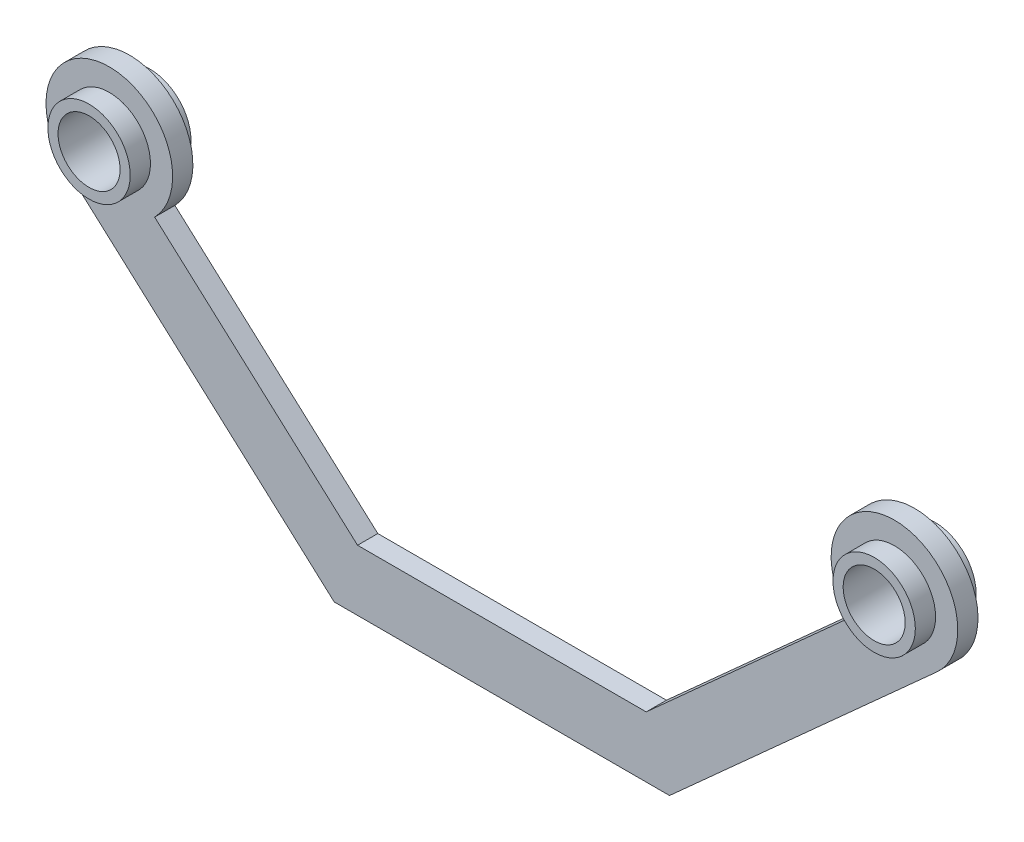
ISO-10303-21;
HEADER;
FILE_DESCRIPTION(('STEP AP214'),'2;1');
FILE_NAME('part.step','',(''),(''),'','','');
FILE_SCHEMA(('AUTOMOTIVE_DESIGN { 1 0 10303 214 1 1 1 1 }'));
ENDSEC;
DATA;
#1=APPLICATION_CONTEXT('core data for automotive mechanical design processes');
#2=APPLICATION_PROTOCOL_DEFINITION('international standard','automotive_design',2000,#1);
#3=PRODUCT_CONTEXT('',#1,'mechanical');
#4=PRODUCT('Part','Part','',(#3));
#5=PRODUCT_RELATED_PRODUCT_CATEGORY('part','',(#4));
#6=PRODUCT_DEFINITION_FORMATION('','',#4);
#7=PRODUCT_DEFINITION_CONTEXT('part definition',#1,'design');
#8=PRODUCT_DEFINITION('design','',#6,#7);
#9=PRODUCT_DEFINITION_SHAPE('','',#8);
#10=(LENGTH_UNIT() NAMED_UNIT(*) SI_UNIT(.MILLI.,.METRE.));
#11=(NAMED_UNIT(*) PLANE_ANGLE_UNIT() SI_UNIT($,.RADIAN.));
#12=(NAMED_UNIT(*) SI_UNIT($,.STERADIAN.) SOLID_ANGLE_UNIT());
#13=UNCERTAINTY_MEASURE_WITH_UNIT(LENGTH_MEASURE(1.E-05),#10,'distance_accuracy_value','');
#14=(GEOMETRIC_REPRESENTATION_CONTEXT(3) GLOBAL_UNCERTAINTY_ASSIGNED_CONTEXT((#13)) GLOBAL_UNIT_ASSIGNED_CONTEXT((#10,
#11,#12)) REPRESENTATION_CONTEXT('',''));
#15=CARTESIAN_POINT('',(0.,0.,0.));
#16=DIRECTION('',(0.,0.,1.));
#17=DIRECTION('',(1.,0.,0.));
#18=AXIS2_PLACEMENT_3D('',#15,#16,#17);
#19=CARTESIAN_POINT('',(0.,0.,4.));
#20=DIRECTION('',(0.,0.,1.));
#21=DIRECTION('',(1.,0.,0.));
#22=AXIS2_PLACEMENT_3D('',#19,#20,#21);
#23=PLANE('',#22);
#24=CARTESIAN_POINT('',(77.5,0.,4.));
#25=DIRECTION('',(0.,0.,1.));
#26=DIRECTION('',(1.,0.,0.));
#27=AXIS2_PLACEMENT_3D('',#24,#25,#26);
#28=CIRCLE('',#27,12.5);
#29=CARTESIAN_POINT('',(68.5526894079265,-8.72901100749507,4.));
#30=VERTEX_POINT('',#29);
#31=CARTESIAN_POINT('',(85.8641325794857,-9.28931031846739,4.));
#32=VERTEX_POINT('',#31);
#33=EDGE_CURVE('E161',#30,#32,#28,.F.);
#34=ORIENTED_EDGE('',*,*,#33,.F.);
#35=DIRECTION('',(-0.743144825477393,-0.66913060635886,0.));
#36=VECTOR('',#35,1.);
#37=CARTESIAN_POINT('',(35.034087351558,-38.9092958582593,4.));
#38=LINE('',#37,#36);
#39=CARTESIAN_POINT('',(28.4917976105847,-44.8,4.));
#40=VERTEX_POINT('',#39);
#41=EDGE_CURVE('E163',#30,#40,#38,.T.);
#42=ORIENTED_EDGE('',*,*,#41,.T.);
#43=DIRECTION('',(1.,0.,0.));
#44=VECTOR('',#43,1.);
#45=CARTESIAN_POINT('',(0.,-44.8,4.));
#46=LINE('',#45,#44);
#47=CARTESIAN_POINT('',(-28.4917976105847,-44.8,4.));
#48=VERTEX_POINT('',#47);
#49=EDGE_CURVE('E166',#48,#40,#46,.T.);
#50=ORIENTED_EDGE('',*,*,#49,.F.);
#51=DIRECTION('',(0.743144825477393,-0.66913060635886,0.));
#52=VECTOR('',#51,1.);
#53=CARTESIAN_POINT('',(-35.034087351558,-38.9092958582593,4.));
#54=LINE('',#53,#52);
#55=CARTESIAN_POINT('',(-68.5526894079265,-8.72901100749507,4.));
#56=VERTEX_POINT('',#55);
#57=EDGE_CURVE('E170',#56,#48,#54,.T.);
#58=ORIENTED_EDGE('',*,*,#57,.F.);
#59=CARTESIAN_POINT('',(-77.5,0.,4.));
#60=DIRECTION('',(0.,0.,1.));
#61=DIRECTION('',(1.,0.,0.));
#62=AXIS2_PLACEMENT_3D('',#59,#60,#61);
#63=CIRCLE('',#62,12.5);
#64=CARTESIAN_POINT('',(-85.8641325794857,-9.28931031846743,4.));
#65=VERTEX_POINT('',#64);
#66=EDGE_CURVE('E122',#56,#65,#63,.T.);
#67=ORIENTED_EDGE('',*,*,#66,.T.);
#68=DIRECTION('',(0.743144825477393,-0.66913060635886,0.));
#69=VECTOR('',#68,1.);
#70=CARTESIAN_POINT('',(-43.0636546278643,-47.827033763988,4.));
#71=LINE('',#70,#69);
#72=CARTESIAN_POINT('',(-33.0981660310097,-56.8,4.));
#73=VERTEX_POINT('',#72);
#74=EDGE_CURVE('E115',#65,#73,#71,.T.);
#75=ORIENTED_EDGE('',*,*,#74,.T.);
#76=DIRECTION('',(1.,0.,0.));
#77=VECTOR('',#76,1.);
#78=CARTESIAN_POINT('',(0.,-56.8,4.));
#79=LINE('',#78,#77);
#80=CARTESIAN_POINT('',(33.0981660310097,-56.8,4.));
#81=VERTEX_POINT('',#80);
#82=EDGE_CURVE('E106',#73,#81,#79,.T.);
#83=ORIENTED_EDGE('',*,*,#82,.T.);
#84=DIRECTION('',(-0.743144825477393,-0.66913060635886,0.));
#85=VECTOR('',#84,1.);
#86=CARTESIAN_POINT('',(43.0636546278643,-47.827033763988,4.));
#87=LINE('',#86,#85);
#88=EDGE_CURVE('E114',#32,#81,#87,.T.);
#89=ORIENTED_EDGE('',*,*,#88,.F.);
#90=EDGE_LOOP('',(#34,#42,#50,#58,#67,#75,#83,#89));
#91=FACE_BOUND('',#90,.T.);
#92=CARTESIAN_POINT('',(-77.5,0.,4.));
#93=DIRECTION('',(0.,0.,1.));
#94=DIRECTION('',(1.,0.,0.));
#95=AXIS2_PLACEMENT_3D('',#92,#93,#94);
#96=CIRCLE('',#95,8.12500000000001);
#97=CARTESIAN_POINT('',(-69.375,0.,4.));
#98=VERTEX_POINT('',#97);
#99=EDGE_CURVE('E46',#98,#98,#96,.T.);
#100=ORIENTED_EDGE('',*,*,#99,.F.);
#101=EDGE_LOOP('',(#100));
#102=FACE_BOUND('',#101,.T.);
#103=CARTESIAN_POINT('',(77.5,0.,4.));
#104=DIRECTION('',(0.,0.,1.));
#105=DIRECTION('',(1.,0.,0.));
#106=AXIS2_PLACEMENT_3D('',#103,#104,#105);
#107=CIRCLE('',#106,8.12500000000001);
#108=CARTESIAN_POINT('',(85.625,0.,4.));
#109=VERTEX_POINT('',#108);
#110=EDGE_CURVE('E262',#109,#109,#107,.F.);
#111=ORIENTED_EDGE('',*,*,#110,.T.);
#112=EDGE_LOOP('',(#111));
#113=FACE_BOUND('',#112,.T.);
#114=ADVANCED_FACE('F37',(#91,#102,#113),#23,.T.);
#115=CARTESIAN_POINT('',(0.,0.,0.));
#116=DIRECTION('',(0.,0.,1.));
#117=DIRECTION('',(1.,0.,0.));
#118=AXIS2_PLACEMENT_3D('',#115,#116,#117);
#119=PLANE('',#118);
#120=CARTESIAN_POINT('',(77.5,0.,0.));
#121=DIRECTION('',(0.,0.,1.));
#122=DIRECTION('',(1.,0.,0.));
#123=AXIS2_PLACEMENT_3D('',#120,#121,#122);
#124=CIRCLE('',#123,12.5);
#125=CARTESIAN_POINT('',(68.5526894079265,-8.72901100749507,0.));
#126=VERTEX_POINT('',#125);
#127=CARTESIAN_POINT('',(85.8641325794857,-9.28931031846739,0.));
#128=VERTEX_POINT('',#127);
#129=EDGE_CURVE('E143',#126,#128,#124,.F.);
#130=ORIENTED_EDGE('',*,*,#129,.T.);
#131=DIRECTION('',(-0.743144825477393,-0.66913060635886,0.));
#132=VECTOR('',#131,1.);
#133=CARTESIAN_POINT('',(43.0636546278643,-47.827033763988,0.));
#134=LINE('',#133,#132);
#135=CARTESIAN_POINT('',(33.0981660310097,-56.8,0.));
#136=VERTEX_POINT('',#135);
#137=EDGE_CURVE('E164',#128,#136,#134,.T.);
#138=ORIENTED_EDGE('',*,*,#137,.T.);
#139=DIRECTION('',(1.,0.,0.));
#140=VECTOR('',#139,1.);
#141=CARTESIAN_POINT('',(0.,-56.8,0.));
#142=LINE('',#141,#140);
#143=CARTESIAN_POINT('',(-33.0981660310097,-56.8,0.));
#144=VERTEX_POINT('',#143);
#145=EDGE_CURVE('E188',#144,#136,#142,.T.);
#146=ORIENTED_EDGE('',*,*,#145,.F.);
#147=DIRECTION('',(0.743144825477393,-0.66913060635886,0.));
#148=VECTOR('',#147,1.);
#149=CARTESIAN_POINT('',(-43.0636546278643,-47.827033763988,0.));
#150=LINE('',#149,#148);
#151=CARTESIAN_POINT('',(-85.8641325794857,-9.28931031846743,0.));
#152=VERTEX_POINT('',#151);
#153=EDGE_CURVE('E128',#152,#144,#150,.T.);
#154=ORIENTED_EDGE('',*,*,#153,.F.);
#155=CARTESIAN_POINT('',(-77.5,0.,0.));
#156=DIRECTION('',(0.,0.,1.));
#157=DIRECTION('',(1.,0.,0.));
#158=AXIS2_PLACEMENT_3D('',#155,#156,#157);
#159=CIRCLE('',#158,12.5);
#160=CARTESIAN_POINT('',(-68.5526894079265,-8.72901100749507,0.));
#161=VERTEX_POINT('',#160);
#162=EDGE_CURVE('E184',#161,#152,#159,.T.);
#163=ORIENTED_EDGE('',*,*,#162,.F.);
#164=DIRECTION('',(0.743144825477393,-0.66913060635886,0.));
#165=VECTOR('',#164,1.);
#166=CARTESIAN_POINT('',(-35.034087351558,-38.9092958582593,0.));
#167=LINE('',#166,#165);
#168=CARTESIAN_POINT('',(-28.4917976105847,-44.8,0.));
#169=VERTEX_POINT('',#168);
#170=EDGE_CURVE('E181',#161,#169,#167,.T.);
#171=ORIENTED_EDGE('',*,*,#170,.T.);
#172=DIRECTION('',(1.,0.,0.));
#173=VECTOR('',#172,1.);
#174=CARTESIAN_POINT('',(0.,-44.8,0.));
#175=LINE('',#174,#173);
#176=CARTESIAN_POINT('',(28.4917976105847,-44.8,0.));
#177=VERTEX_POINT('',#176);
#178=EDGE_CURVE('E177',#169,#177,#175,.T.);
#179=ORIENTED_EDGE('',*,*,#178,.T.);
#180=DIRECTION('',(-0.743144825477393,-0.66913060635886,0.));
#181=VECTOR('',#180,1.);
#182=CARTESIAN_POINT('',(35.034087351558,-38.9092958582593,0.));
#183=LINE('',#182,#181);
#184=EDGE_CURVE('E147',#126,#177,#183,.T.);
#185=ORIENTED_EDGE('',*,*,#184,.F.);
#186=EDGE_LOOP('',(#130,#138,#146,#154,#163,#171,#179,#185));
#187=FACE_BOUND('',#186,.T.);
#188=CARTESIAN_POINT('',(-77.5,0.,0.));
#189=DIRECTION('',(0.,0.,1.));
#190=DIRECTION('',(1.,0.,0.));
#191=AXIS2_PLACEMENT_3D('',#188,#189,#190);
#192=CIRCLE('',#191,8.12500000000001);
#193=CARTESIAN_POINT('',(-69.375,0.,0.));
#194=VERTEX_POINT('',#193);
#195=EDGE_CURVE('E141',#194,#194,#192,.T.);
#196=ORIENTED_EDGE('',*,*,#195,.T.);
#197=EDGE_LOOP('',(#196));
#198=FACE_BOUND('',#197,.T.);
#199=CARTESIAN_POINT('',(77.5,0.,0.));
#200=DIRECTION('',(0.,0.,1.));
#201=DIRECTION('',(1.,0.,0.));
#202=AXIS2_PLACEMENT_3D('',#199,#200,#201);
#203=CIRCLE('',#202,8.12500000000001);
#204=CARTESIAN_POINT('',(85.625,0.,0.));
#205=VERTEX_POINT('',#204);
#206=EDGE_CURVE('E11',#205,#205,#203,.F.);
#207=ORIENTED_EDGE('',*,*,#206,.F.);
#208=EDGE_LOOP('',(#207));
#209=FACE_BOUND('',#208,.T.);
#210=ADVANCED_FACE('F192',(#187,#198,#209),#119,.F.);
#211=CARTESIAN_POINT('',(-77.5,0.,-4.));
#212=DIRECTION('',(0.,0.,1.));
#213=DIRECTION('',(1.,0.,0.));
#214=AXIS2_PLACEMENT_3D('',#211,#212,#213);
#215=CYLINDRICAL_SURFACE('',#214,8.12500000000001);
#216=CARTESIAN_POINT('',(-77.5,0.,-4.));
#217=DIRECTION('',(0.,0.,1.));
#218=DIRECTION('',(1.,0.,0.));
#219=AXIS2_PLACEMENT_3D('',#216,#217,#218);
#220=CIRCLE('',#219,8.12500000000001);
#221=CARTESIAN_POINT('',(-69.375,0.,-4.));
#222=VERTEX_POINT('',#221);
#223=EDGE_CURVE('E144',#222,#222,#220,.T.);
#224=ORIENTED_EDGE('',*,*,#223,.T.);
#225=EDGE_LOOP('',(#224));
#226=FACE_BOUND('',#225,.T.);
#227=ORIENTED_EDGE('',*,*,#195,.F.);
#228=EDGE_LOOP('',(#227));
#229=FACE_BOUND('',#228,.T.);
#230=ADVANCED_FACE('F213',(#226,#229),#215,.T.);
#231=ORIENTED_EDGE('',*,*,#99,.T.);
#232=EDGE_LOOP('',(#231));
#233=FACE_BOUND('',#232,.T.);
#234=CARTESIAN_POINT('',(-77.5,0.,8.));
#235=DIRECTION('',(0.,0.,1.));
#236=DIRECTION('',(1.,0.,0.));
#237=AXIS2_PLACEMENT_3D('',#234,#235,#236);
#238=CIRCLE('',#237,8.12500000000001);
#239=CARTESIAN_POINT('',(-69.375,0.,8.));
#240=VERTEX_POINT('',#239);
#241=EDGE_CURVE('E155',#240,#240,#238,.T.);
#242=ORIENTED_EDGE('',*,*,#241,.F.);
#243=EDGE_LOOP('',(#242));
#244=FACE_BOUND('',#243,.T.);
#245=ADVANCED_FACE('F215',(#233,#244),#215,.T.);
#246=CARTESIAN_POINT('',(-77.5,0.,-4.));
#247=DIRECTION('',(0.,0.,1.));
#248=DIRECTION('',(1.,0.,0.));
#249=AXIS2_PLACEMENT_3D('',#246,#247,#248);
#250=PLANE('',#249);
#251=CARTESIAN_POINT('',(-77.5,0.,-4.));
#252=DIRECTION('',(0.,0.,1.));
#253=DIRECTION('',(1.,0.,0.));
#254=AXIS2_PLACEMENT_3D('',#251,#252,#253);
#255=CIRCLE('',#254,6.12500000000001);
#256=CARTESIAN_POINT('',(-71.375,0.,-4.));
#257=VERTEX_POINT('',#256);
#258=EDGE_CURVE('E150',#257,#257,#255,.T.);
#259=ORIENTED_EDGE('',*,*,#258,.T.);
#260=EDGE_LOOP('',(#259));
#261=FACE_BOUND('',#260,.T.);
#262=ORIENTED_EDGE('',*,*,#223,.F.);
#263=EDGE_LOOP('',(#262));
#264=FACE_BOUND('',#263,.T.);
#265=ADVANCED_FACE('F218',(#261,#264),#250,.F.);
#266=CARTESIAN_POINT('',(-77.5,0.,-4.));
#267=DIRECTION('',(0.,0.,1.));
#268=DIRECTION('',(1.,0.,0.));
#269=AXIS2_PLACEMENT_3D('',#266,#267,#268);
#270=CYLINDRICAL_SURFACE('',#269,6.12500000000001);
#271=ORIENTED_EDGE('',*,*,#258,.F.);
#272=EDGE_LOOP('',(#271));
#273=FACE_BOUND('',#272,.T.);
#274=CARTESIAN_POINT('',(-77.5,0.,8.));
#275=DIRECTION('',(0.,0.,1.));
#276=DIRECTION('',(1.,0.,0.));
#277=AXIS2_PLACEMENT_3D('',#274,#275,#276);
#278=CIRCLE('',#277,6.12500000000001);
#279=CARTESIAN_POINT('',(-71.375,0.,8.));
#280=VERTEX_POINT('',#279);
#281=EDGE_CURVE('E265',#280,#280,#278,.T.);
#282=ORIENTED_EDGE('',*,*,#281,.T.);
#283=EDGE_LOOP('',(#282));
#284=FACE_BOUND('',#283,.T.);
#285=ADVANCED_FACE('F222',(#273,#284),#270,.F.);
#286=CARTESIAN_POINT('',(-77.5,0.,8.));
#287=DIRECTION('',(0.,0.,1.));
#288=DIRECTION('',(1.,0.,0.));
#289=AXIS2_PLACEMENT_3D('',#286,#287,#288);
#290=PLANE('',#289);
#291=ORIENTED_EDGE('',*,*,#241,.T.);
#292=EDGE_LOOP('',(#291));
#293=FACE_BOUND('',#292,.T.);
#294=ORIENTED_EDGE('',*,*,#281,.F.);
#295=EDGE_LOOP('',(#294));
#296=FACE_BOUND('',#295,.T.);
#297=ADVANCED_FACE('F226',(#293,#296),#290,.T.);
#298=CARTESIAN_POINT('',(77.5,0.,4.));
#299=DIRECTION('',(0.,0.,-1.));
#300=DIRECTION('',(-1.,0.,0.));
#301=AXIS2_PLACEMENT_3D('',#298,#299,#300);
#302=CYLINDRICAL_SURFACE('',#301,12.5);
#303=ORIENTED_EDGE('',*,*,#129,.F.);
#304=DIRECTION('',(0.,0.,-1.));
#305=VECTOR('',#304,1.);
#306=CARTESIAN_POINT('',(68.5526894079265,-8.72901100749507,4.));
#307=LINE('',#306,#305);
#308=EDGE_CURVE('E90',#30,#126,#307,.T.);
#309=ORIENTED_EDGE('',*,*,#308,.F.);
#310=ORIENTED_EDGE('',*,*,#33,.T.);
#311=DIRECTION('',(0.,0.,-1.));
#312=VECTOR('',#311,1.);
#313=CARTESIAN_POINT('',(85.8641325794857,-9.28931031846739,4.));
#314=LINE('',#313,#312);
#315=EDGE_CURVE('E54',#32,#128,#314,.T.);
#316=ORIENTED_EDGE('',*,*,#315,.T.);
#317=EDGE_LOOP('',(#303,#309,#310,#316));
#318=FACE_BOUND('',#317,.T.);
#319=ADVANCED_FACE('F39',(#318),#302,.T.);
#320=CARTESIAN_POINT('',(35.034087351558,-38.9092958582593,4.));
#321=DIRECTION('',(0.66913060635886,-0.743144825477393,0.));
#322=DIRECTION('',(0.743144825477393,0.66913060635886,0.));
#323=AXIS2_PLACEMENT_3D('',#320,#321,#322);
#324=PLANE('',#323);
#325=ORIENTED_EDGE('',*,*,#184,.T.);
#326=DIRECTION('',(0.,0.,-1.));
#327=VECTOR('',#326,1.);
#328=CARTESIAN_POINT('',(28.4917976105847,-44.8,4.));
#329=LINE('',#328,#327);
#330=EDGE_CURVE('E139',#40,#177,#329,.T.);
#331=ORIENTED_EDGE('',*,*,#330,.F.);
#332=ORIENTED_EDGE('',*,*,#41,.F.);
#333=ORIENTED_EDGE('',*,*,#308,.T.);
#334=EDGE_LOOP('',(#325,#331,#332,#333));
#335=FACE_BOUND('',#334,.T.);
#336=ADVANCED_FACE('F388',(#335),#324,.F.);
#337=CARTESIAN_POINT('',(0.,-44.8,4.));
#338=DIRECTION('',(0.,1.,0.));
#339=DIRECTION('',(-1.,0.,0.));
#340=AXIS2_PLACEMENT_3D('',#337,#338,#339);
#341=PLANE('',#340);
#342=ORIENTED_EDGE('',*,*,#178,.F.);
#343=DIRECTION('',(0.,0.,-1.));
#344=VECTOR('',#343,1.);
#345=CARTESIAN_POINT('',(-28.4917976105847,-44.8,4.));
#346=LINE('',#345,#344);
#347=EDGE_CURVE('E137',#48,#169,#346,.T.);
#348=ORIENTED_EDGE('',*,*,#347,.F.);
#349=ORIENTED_EDGE('',*,*,#49,.T.);
#350=ORIENTED_EDGE('',*,*,#330,.T.);
#351=EDGE_LOOP('',(#342,#348,#349,#350));
#352=FACE_BOUND('',#351,.T.);
#353=ADVANCED_FACE('F378',(#352),#341,.T.);
#354=CARTESIAN_POINT('',(-35.034087351558,-38.9092958582593,4.));
#355=DIRECTION('',(0.66913060635886,0.743144825477393,0.));
#356=DIRECTION('',(-0.743144825477393,0.66913060635886,0.));
#357=AXIS2_PLACEMENT_3D('',#354,#355,#356);
#358=PLANE('',#357);
#359=ORIENTED_EDGE('',*,*,#170,.F.);
#360=DIRECTION('',(0.,0.,-1.));
#361=VECTOR('',#360,1.);
#362=CARTESIAN_POINT('',(-68.5526894079265,-8.72901100749507,4.));
#363=LINE('',#362,#361);
#364=EDGE_CURVE('E131',#56,#161,#363,.T.);
#365=ORIENTED_EDGE('',*,*,#364,.F.);
#366=ORIENTED_EDGE('',*,*,#57,.T.);
#367=ORIENTED_EDGE('',*,*,#347,.T.);
#368=EDGE_LOOP('',(#359,#365,#366,#367));
#369=FACE_BOUND('',#368,.T.);
#370=ADVANCED_FACE('F368',(#369),#358,.T.);
#371=CARTESIAN_POINT('',(-77.5,0.,4.));
#372=DIRECTION('',(0.,0.,-1.));
#373=DIRECTION('',(-1.,0.,0.));
#374=AXIS2_PLACEMENT_3D('',#371,#372,#373);
#375=CYLINDRICAL_SURFACE('',#374,12.5);
#376=ORIENTED_EDGE('',*,*,#162,.T.);
#377=DIRECTION('',(0.,0.,-1.));
#378=VECTOR('',#377,1.);
#379=CARTESIAN_POINT('',(-85.8641325794857,-9.28931031846743,4.));
#380=LINE('',#379,#378);
#381=EDGE_CURVE('E129',#65,#152,#380,.T.);
#382=ORIENTED_EDGE('',*,*,#381,.F.);
#383=ORIENTED_EDGE('',*,*,#66,.F.);
#384=ORIENTED_EDGE('',*,*,#364,.T.);
#385=EDGE_LOOP('',(#376,#382,#383,#384));
#386=FACE_BOUND('',#385,.T.);
#387=ADVANCED_FACE('F359',(#386),#375,.T.);
#388=CARTESIAN_POINT('',(-43.0636546278643,-47.827033763988,4.));
#389=DIRECTION('',(0.66913060635886,0.743144825477393,0.));
#390=DIRECTION('',(-0.743144825477393,0.66913060635886,0.));
#391=AXIS2_PLACEMENT_3D('',#388,#389,#390);
#392=PLANE('',#391);
#393=ORIENTED_EDGE('',*,*,#153,.T.);
#394=DIRECTION('',(0.,0.,-1.));
#395=VECTOR('',#394,1.);
#396=CARTESIAN_POINT('',(-33.0981660310097,-56.8,4.));
#397=LINE('',#396,#395);
#398=EDGE_CURVE('E110',#73,#144,#397,.T.);
#399=ORIENTED_EDGE('',*,*,#398,.F.);
#400=ORIENTED_EDGE('',*,*,#74,.F.);
#401=ORIENTED_EDGE('',*,*,#381,.T.);
#402=EDGE_LOOP('',(#393,#399,#400,#401));
#403=FACE_BOUND('',#402,.T.);
#404=ADVANCED_FACE('F127',(#403),#392,.F.);
#405=CARTESIAN_POINT('',(0.,-56.8,4.));
#406=DIRECTION('',(0.,1.,0.));
#407=DIRECTION('',(0.,0.,1.));
#408=AXIS2_PLACEMENT_3D('',#405,#406,#407);
#409=PLANE('',#408);
#410=ORIENTED_EDGE('',*,*,#145,.T.);
#411=DIRECTION('',(0.,0.,-1.));
#412=VECTOR('',#411,1.);
#413=CARTESIAN_POINT('',(33.0981660310097,-56.8,4.));
#414=LINE('',#413,#412);
#415=EDGE_CURVE('E81',#81,#136,#414,.T.);
#416=ORIENTED_EDGE('',*,*,#415,.F.);
#417=ORIENTED_EDGE('',*,*,#82,.F.);
#418=ORIENTED_EDGE('',*,*,#398,.T.);
#419=EDGE_LOOP('',(#410,#416,#417,#418));
#420=FACE_BOUND('',#419,.T.);
#421=ADVANCED_FACE('F108',(#420),#409,.F.);
#422=CARTESIAN_POINT('',(43.0636546278643,-47.827033763988,4.));
#423=DIRECTION('',(0.66913060635886,-0.743144825477393,0.));
#424=DIRECTION('',(0.743144825477393,0.66913060635886,0.));
#425=AXIS2_PLACEMENT_3D('',#422,#423,#424);
#426=PLANE('',#425);
#427=ORIENTED_EDGE('',*,*,#137,.F.);
#428=ORIENTED_EDGE('',*,*,#315,.F.);
#429=ORIENTED_EDGE('',*,*,#88,.T.);
#430=ORIENTED_EDGE('',*,*,#415,.T.);
#431=EDGE_LOOP('',(#427,#428,#429,#430));
#432=FACE_BOUND('',#431,.T.);
#433=ADVANCED_FACE('F194',(#432),#426,.T.);
#434=CARTESIAN_POINT('',(77.5,0.,-4.));
#435=DIRECTION('',(0.,0.,1.));
#436=DIRECTION('',(1.,0.,0.));
#437=AXIS2_PLACEMENT_3D('',#434,#435,#436);
#438=CYLINDRICAL_SURFACE('',#437,8.12500000000001);
#439=CARTESIAN_POINT('',(77.5,0.,-4.));
#440=DIRECTION('',(0.,0.,-1.));
#441=DIRECTION('',(-1.,0.,0.));
#442=AXIS2_PLACEMENT_3D('',#439,#440,#441);
#443=CIRCLE('',#442,8.12500000000001);
#444=CARTESIAN_POINT('',(69.375,0.,-4.));
#445=VERTEX_POINT('',#444);
#446=EDGE_CURVE('E256',#445,#445,#443,.T.);
#447=ORIENTED_EDGE('',*,*,#446,.F.);
#448=EDGE_LOOP('',(#447));
#449=FACE_BOUND('',#448,.T.);
#450=ORIENTED_EDGE('',*,*,#206,.T.);
#451=EDGE_LOOP('',(#450));
#452=FACE_BOUND('',#451,.T.);
#453=ADVANCED_FACE('F196',(#449,#452),#438,.T.);
#454=CARTESIAN_POINT('',(77.5,0.,-4.));
#455=DIRECTION('',(0.,0.,1.));
#456=DIRECTION('',(-1.,0.,0.));
#457=AXIS2_PLACEMENT_3D('',#454,#455,#456);
#458=PLANE('',#457);
#459=ORIENTED_EDGE('',*,*,#446,.T.);
#460=EDGE_LOOP('',(#459));
#461=FACE_BOUND('',#460,.T.);
#462=CARTESIAN_POINT('',(77.5,0.,-4.));
#463=DIRECTION('',(0.,0.,-1.));
#464=DIRECTION('',(-1.,0.,0.));
#465=AXIS2_PLACEMENT_3D('',#462,#463,#464);
#466=CIRCLE('',#465,6.12500000000001);
#467=CARTESIAN_POINT('',(71.375,0.,-4.));
#468=VERTEX_POINT('',#467);
#469=EDGE_CURVE('E253',#468,#468,#466,.T.);
#470=ORIENTED_EDGE('',*,*,#469,.F.);
#471=EDGE_LOOP('',(#470));
#472=FACE_BOUND('',#471,.T.);
#473=ADVANCED_FACE('F202',(#461,#472),#458,.F.);
#474=ORIENTED_EDGE('',*,*,#110,.F.);
#475=EDGE_LOOP('',(#474));
#476=FACE_BOUND('',#475,.T.);
#477=CARTESIAN_POINT('',(77.5,0.,8.));
#478=DIRECTION('',(0.,0.,-1.));
#479=DIRECTION('',(-1.,0.,0.));
#480=AXIS2_PLACEMENT_3D('',#477,#478,#479);
#481=CIRCLE('',#480,8.12500000000001);
#482=CARTESIAN_POINT('',(69.375,0.,8.));
#483=VERTEX_POINT('',#482);
#484=EDGE_CURVE('E251',#483,#483,#481,.T.);
#485=ORIENTED_EDGE('',*,*,#484,.T.);
#486=EDGE_LOOP('',(#485));
#487=FACE_BOUND('',#486,.T.);
#488=ADVANCED_FACE('F205',(#476,#487),#438,.T.);
#489=CARTESIAN_POINT('',(77.5,0.,-4.));
#490=DIRECTION('',(0.,0.,1.));
#491=DIRECTION('',(1.,0.,0.));
#492=AXIS2_PLACEMENT_3D('',#489,#490,#491);
#493=CYLINDRICAL_SURFACE('',#492,6.12500000000001);
#494=ORIENTED_EDGE('',*,*,#469,.T.);
#495=EDGE_LOOP('',(#494));
#496=FACE_BOUND('',#495,.T.);
#497=CARTESIAN_POINT('',(77.5,0.,8.));
#498=DIRECTION('',(0.,0.,-1.));
#499=DIRECTION('',(-1.,0.,0.));
#500=AXIS2_PLACEMENT_3D('',#497,#498,#499);
#501=CIRCLE('',#500,6.12500000000001);
#502=CARTESIAN_POINT('',(71.375,0.,8.));
#503=VERTEX_POINT('',#502);
#504=EDGE_CURVE('E248',#503,#503,#501,.T.);
#505=ORIENTED_EDGE('',*,*,#504,.F.);
#506=EDGE_LOOP('',(#505));
#507=FACE_BOUND('',#506,.T.);
#508=ADVANCED_FACE('F232',(#496,#507),#493,.F.);
#509=CARTESIAN_POINT('',(77.5,0.,8.));
#510=DIRECTION('',(0.,0.,1.));
#511=DIRECTION('',(-1.,0.,0.));
#512=AXIS2_PLACEMENT_3D('',#509,#510,#511);
#513=PLANE('',#512);
#514=ORIENTED_EDGE('',*,*,#504,.T.);
#515=EDGE_LOOP('',(#514));
#516=FACE_BOUND('',#515,.T.);
#517=ORIENTED_EDGE('',*,*,#484,.F.);
#518=EDGE_LOOP('',(#517));
#519=FACE_BOUND('',#518,.T.);
#520=ADVANCED_FACE('F239',(#516,#519),#513,.T.);
#521=CLOSED_SHELL('',(#114,#210,#230,#245,#265,#285,#297,#319,#336,#353,#370,#387,#404,#421,
#433,#453,#473,#488,#508,#520));
#522=MANIFOLD_SOLID_BREP('B2',#521);
#523=ADVANCED_BREP_SHAPE_REPRESENTATION('',(#18,#522),#14);
#524=SHAPE_DEFINITION_REPRESENTATION(#9,#523);
ENDSEC;
END-ISO-10303-21;
